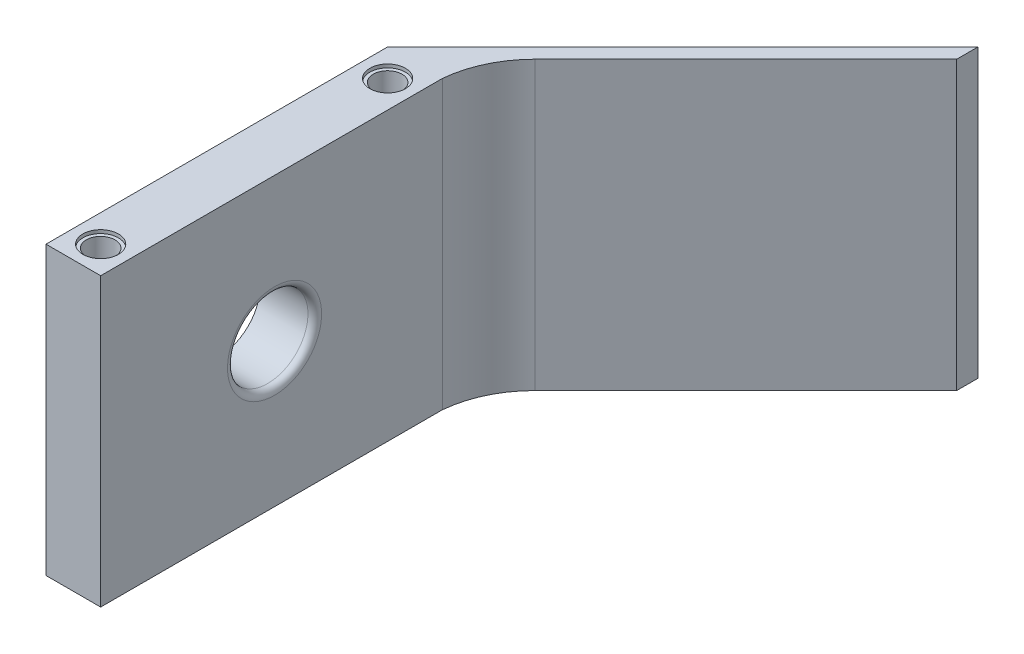
ISO-10303-21;
HEADER;
FILE_DESCRIPTION(('STEP AP214'),'2;1');
FILE_NAME('part.step','',(''),(''),'','','');
FILE_SCHEMA(('AUTOMOTIVE_DESIGN { 1 0 10303 214 1 1 1 1 }'));
ENDSEC;
DATA;
#1=APPLICATION_CONTEXT('core data for automotive mechanical design processes');
#2=APPLICATION_PROTOCOL_DEFINITION('international standard','automotive_design',2000,#1);
#3=PRODUCT_CONTEXT('',#1,'mechanical');
#4=PRODUCT('Part','Part','',(#3));
#5=PRODUCT_RELATED_PRODUCT_CATEGORY('part','',(#4));
#6=PRODUCT_DEFINITION_FORMATION('','',#4);
#7=PRODUCT_DEFINITION_CONTEXT('part definition',#1,'design');
#8=PRODUCT_DEFINITION('design','',#6,#7);
#9=PRODUCT_DEFINITION_SHAPE('','',#8);
#10=(LENGTH_UNIT() NAMED_UNIT(*) SI_UNIT(.MILLI.,.METRE.));
#11=(NAMED_UNIT(*) PLANE_ANGLE_UNIT() SI_UNIT($,.RADIAN.));
#12=(NAMED_UNIT(*) SI_UNIT($,.STERADIAN.) SOLID_ANGLE_UNIT());
#13=UNCERTAINTY_MEASURE_WITH_UNIT(LENGTH_MEASURE(1.E-05),#10,'distance_accuracy_value','');
#14=(GEOMETRIC_REPRESENTATION_CONTEXT(3) GLOBAL_UNCERTAINTY_ASSIGNED_CONTEXT((#13)) GLOBAL_UNIT_ASSIGNED_CONTEXT((#10,
#11,#12)) REPRESENTATION_CONTEXT('',''));
#15=CARTESIAN_POINT('',(0.,0.,0.));
#16=DIRECTION('',(0.,0.,1.));
#17=DIRECTION('',(1.,0.,0.));
#18=AXIS2_PLACEMENT_3D('',#15,#16,#17);
#19=CARTESIAN_POINT('',(-14.2230483271375,-42.,-32.3847583643123));
#20=DIRECTION('',(0.,1.,0.));
#21=DIRECTION('',(0.,0.,1.));
#22=AXIS2_PLACEMENT_3D('',#19,#20,#21);
#23=CYLINDRICAL_SURFACE('',#22,2.1);
#24=CARTESIAN_POINT('',(-14.2230483271375,-41.5,-32.3847583643123));
#25=DIRECTION('',(0.,-1.,0.));
#26=DIRECTION('',(0.,0.,-1.));
#27=AXIS2_PLACEMENT_3D('',#24,#25,#26);
#28=CIRCLE('',#27,2.1);
#29=CARTESIAN_POINT('',(-14.2230483271375,-41.5,-34.4847583643123));
#30=VERTEX_POINT('',#29);
#31=EDGE_CURVE('E155',#30,#30,#28,.T.);
#32=ORIENTED_EDGE('',*,*,#31,.T.);
#33=EDGE_LOOP('',(#32));
#34=FACE_BOUND('',#33,.T.);
#35=CARTESIAN_POINT('',(-14.2230483271375,-0.5,-32.3847583643123));
#36=DIRECTION('',(0.,1.,0.));
#37=DIRECTION('',(0.,0.,1.));
#38=AXIS2_PLACEMENT_3D('',#35,#36,#37);
#39=CIRCLE('',#38,2.1);
#40=CARTESIAN_POINT('',(-14.2230483271375,-0.5,-30.2847583643123));
#41=VERTEX_POINT('',#40);
#42=EDGE_CURVE('E138',#41,#41,#39,.F.);
#43=ORIENTED_EDGE('',*,*,#42,.F.);
#44=EDGE_LOOP('',(#43));
#45=FACE_BOUND('',#44,.T.);
#46=ADVANCED_FACE('F43',(#34,#45),#23,.F.);
#47=CARTESIAN_POINT('',(-14.2230483271375,-42.,9.61524163568774));
#48=DIRECTION('',(0.,1.,0.));
#49=DIRECTION('',(0.,0.,1.));
#50=AXIS2_PLACEMENT_3D('',#47,#48,#49);
#51=CYLINDRICAL_SURFACE('',#50,2.1);
#52=CARTESIAN_POINT('',(-14.2230483271375,-41.5,9.61524163568774));
#53=DIRECTION('',(0.,-1.,0.));
#54=DIRECTION('',(0.,0.,-1.));
#55=AXIS2_PLACEMENT_3D('',#52,#53,#54);
#56=CIRCLE('',#55,2.1);
#57=CARTESIAN_POINT('',(-14.2230483271375,-41.5,7.51524163568774));
#58=VERTEX_POINT('',#57);
#59=EDGE_CURVE('E151',#58,#58,#56,.F.);
#60=ORIENTED_EDGE('',*,*,#59,.F.);
#61=EDGE_LOOP('',(#60));
#62=FACE_BOUND('',#61,.T.);
#63=CARTESIAN_POINT('',(-14.2230483271375,-0.5,9.61524163568774));
#64=DIRECTION('',(0.,1.,0.));
#65=DIRECTION('',(0.,0.,1.));
#66=AXIS2_PLACEMENT_3D('',#63,#64,#65);
#67=CIRCLE('',#66,2.1);
#68=CARTESIAN_POINT('',(-14.2230483271375,-0.5,11.7152416356877));
#69=VERTEX_POINT('',#68);
#70=EDGE_CURVE('E146',#69,#69,#67,.T.);
#71=ORIENTED_EDGE('',*,*,#70,.T.);
#72=EDGE_LOOP('',(#71));
#73=FACE_BOUND('',#72,.T.);
#74=ADVANCED_FACE('F261',(#62,#73),#51,.F.);
#75=CARTESIAN_POINT('',(-10.2230483271375,3.,13.6152416356877));
#76=DIRECTION('',(0.,0.,-1.));
#77=DIRECTION('',(-1.,0.,0.));
#78=AXIS2_PLACEMENT_3D('',#75,#76,#77);
#79=PLANE('',#78);
#80=DIRECTION('',(0.,1.,0.));
#81=VECTOR('',#80,1.);
#82=CARTESIAN_POINT('',(-10.2230483271376,-42.,13.6152416356877));
#83=LINE('',#82,#81);
#84=CARTESIAN_POINT('',(-10.2230483271376,-42.,13.6152416356877));
#85=VERTEX_POINT('',#84);
#86=CARTESIAN_POINT('',(-10.2230483271376,0.,13.6152416356877));
#87=VERTEX_POINT('',#86);
#88=EDGE_CURVE('E197',#85,#87,#83,.T.);
#89=ORIENTED_EDGE('',*,*,#88,.T.);
#90=DIRECTION('',(1.,0.,0.));
#91=VECTOR('',#90,1.);
#92=CARTESIAN_POINT('',(14.7769516728625,0.,13.6152416356877));
#93=LINE('',#92,#91);
#94=CARTESIAN_POINT('',(-18.2230483271375,0.,13.6152416356877));
#95=VERTEX_POINT('',#94);
#96=EDGE_CURVE('E159',#95,#87,#93,.T.);
#97=ORIENTED_EDGE('',*,*,#96,.F.);
#98=DIRECTION('',(0.,1.,0.));
#99=VECTOR('',#98,1.);
#100=CARTESIAN_POINT('',(-18.2230483271375,3.,13.6152416356877));
#101=LINE('',#100,#99);
#102=CARTESIAN_POINT('',(-18.2230483271376,-42.,13.6152416356877));
#103=VERTEX_POINT('',#102);
#104=EDGE_CURVE('E212',#103,#95,#101,.T.);
#105=ORIENTED_EDGE('',*,*,#104,.F.);
#106=DIRECTION('',(-1.,0.,0.));
#107=VECTOR('',#106,1.);
#108=CARTESIAN_POINT('',(-18.2230483271376,-42.,13.6152416356877));
#109=LINE('',#108,#107);
#110=EDGE_CURVE('E193',#85,#103,#109,.T.);
#111=ORIENTED_EDGE('',*,*,#110,.F.);
#112=EDGE_LOOP('',(#89,#97,#105,#111));
#113=FACE_BOUND('',#112,.T.);
#114=ADVANCED_FACE('F248',(#113),#79,.F.);
#115=CARTESIAN_POINT('',(-18.2230483271375,0.,0.));
#116=DIRECTION('',(-1.,0.,0.));
#117=DIRECTION('',(0.,0.,1.));
#118=AXIS2_PLACEMENT_3D('',#115,#116,#117);
#119=PLANE('',#118);
#120=DIRECTION('',(0.,0.,1.));
#121=VECTOR('',#120,1.);
#122=CARTESIAN_POINT('',(-18.2230483271375,0.,0.));
#123=LINE('',#122,#121);
#124=CARTESIAN_POINT('',(-18.2230483271376,0.,-36.3847583643123));
#125=VERTEX_POINT('',#124);
#126=EDGE_CURVE('E162',#125,#95,#123,.T.);
#127=ORIENTED_EDGE('',*,*,#126,.F.);
#128=DIRECTION('',(0.,-1.,0.));
#129=VECTOR('',#128,1.);
#130=CARTESIAN_POINT('',(-18.2230483271376,3.,-36.3847583643123));
#131=LINE('',#130,#129);
#132=CARTESIAN_POINT('',(-18.2230483271376,-42.,-36.3847583643123));
#133=VERTEX_POINT('',#132);
#134=EDGE_CURVE('E208',#125,#133,#131,.T.);
#135=ORIENTED_EDGE('',*,*,#134,.T.);
#136=DIRECTION('',(0.,0.,-1.));
#137=VECTOR('',#136,1.);
#138=CARTESIAN_POINT('',(-18.2230483271376,-42.,-36.3847583643123));
#139=LINE('',#138,#137);
#140=EDGE_CURVE('E186',#103,#133,#139,.T.);
#141=ORIENTED_EDGE('',*,*,#140,.F.);
#142=ORIENTED_EDGE('',*,*,#104,.T.);
#143=EDGE_LOOP('',(#127,#135,#141,#142));
#144=FACE_BOUND('',#143,.T.);
#145=CARTESIAN_POINT('',(-18.2230483271375,-21.,-11.836279123996));
#146=DIRECTION('',(-1.,0.,0.));
#147=DIRECTION('',(0.,0.,1.));
#148=AXIS2_PLACEMENT_3D('',#145,#146,#147);
#149=CIRCLE('',#148,5.88897274573419);
#150=CARTESIAN_POINT('',(-18.2230483271375,-21.,-5.94730637826181));
#151=VERTEX_POINT('',#150);
#152=EDGE_CURVE('E165',#151,#151,#149,.T.);
#153=ORIENTED_EDGE('',*,*,#152,.F.);
#154=EDGE_LOOP('',(#153));
#155=FACE_BOUND('',#154,.T.);
#156=ADVANCED_FACE('F243',(#144,#155),#119,.T.);
#157=CARTESIAN_POINT('',(-10.2230483271376,-42.,-36.3847583643123));
#158=DIRECTION('',(-1.,0.,0.));
#159=DIRECTION('',(0.,0.,1.));
#160=AXIS2_PLACEMENT_3D('',#157,#158,#159);
#161=PLANE('',#160);
#162=CARTESIAN_POINT('',(-10.2230483271376,-21.,-11.836279123996));
#163=DIRECTION('',(-1.,0.,0.));
#164=DIRECTION('',(0.,0.,1.));
#165=AXIS2_PLACEMENT_3D('',#162,#163,#164);
#166=CIRCLE('',#165,6.88897274573419);
#167=CARTESIAN_POINT('',(-10.2230483271376,-21.,-4.94730637826182));
#168=VERTEX_POINT('',#167);
#169=EDGE_CURVE('E216',#168,#168,#166,.T.);
#170=ORIENTED_EDGE('',*,*,#169,.T.);
#171=EDGE_LOOP('',(#170));
#172=FACE_BOUND('',#171,.T.);
#173=DIRECTION('',(0.,0.,1.));
#174=VECTOR('',#173,1.);
#175=CARTESIAN_POINT('',(-10.2230483271376,0.,-36.3847583643123));
#176=LINE('',#175,#174);
#177=CARTESIAN_POINT('',(-10.2230483271376,0.,-36.3847583643123));
#178=VERTEX_POINT('',#177);
#179=EDGE_CURVE('E174',#178,#87,#176,.T.);
#180=ORIENTED_EDGE('',*,*,#179,.T.);
#181=ORIENTED_EDGE('',*,*,#88,.F.);
#182=DIRECTION('',(0.,0.,1.));
#183=VECTOR('',#182,1.);
#184=CARTESIAN_POINT('',(-10.2230483271376,-42.,-36.3847583643123));
#185=LINE('',#184,#183);
#186=CARTESIAN_POINT('',(-10.2230483271376,-42.,-36.3847583643123));
#187=VERTEX_POINT('',#186);
#188=EDGE_CURVE('E190',#187,#85,#185,.T.);
#189=ORIENTED_EDGE('',*,*,#188,.F.);
#190=DIRECTION('',(0.,1.,0.));
#191=VECTOR('',#190,1.);
#192=CARTESIAN_POINT('',(-10.2230483271376,-42.,-36.3847583643123));
#193=LINE('',#192,#191);
#194=EDGE_CURVE('E204',#187,#178,#193,.T.);
#195=ORIENTED_EDGE('',*,*,#194,.T.);
#196=EDGE_LOOP('',(#180,#181,#189,#195));
#197=FACE_BOUND('',#196,.T.);
#198=ADVANCED_FACE('F253',(#172,#197),#161,.F.);
#199=CARTESIAN_POINT('',(0.,-42.,0.));
#200=DIRECTION('',(0.,1.,0.));
#201=DIRECTION('',(0.,0.,1.));
#202=AXIS2_PLACEMENT_3D('',#199,#200,#201);
#203=PLANE('',#202);
#204=CARTESIAN_POINT('',(-14.2230483271375,-42.,-32.3847583643123));
#205=DIRECTION('',(0.,1.,0.));
#206=DIRECTION('',(0.,0.,1.));
#207=AXIS2_PLACEMENT_3D('',#204,#205,#206);
#208=CIRCLE('',#207,2.65);
#209=CARTESIAN_POINT('',(-14.2230483271375,-42.,-29.7347583643123));
#210=VERTEX_POINT('',#209);
#211=EDGE_CURVE('E175',#210,#210,#208,.T.);
#212=ORIENTED_EDGE('',*,*,#211,.T.);
#213=EDGE_LOOP('',(#212));
#214=FACE_BOUND('',#213,.T.);
#215=CARTESIAN_POINT('',(-14.2230483271375,-42.,9.61524163568773));
#216=DIRECTION('',(0.,1.,0.));
#217=DIRECTION('',(0.,0.,1.));
#218=AXIS2_PLACEMENT_3D('',#215,#216,#217);
#219=CIRCLE('',#218,2.65);
#220=CARTESIAN_POINT('',(-14.2230483271375,-42.,12.2652416356877));
#221=VERTEX_POINT('',#220);
#222=EDGE_CURVE('E169',#221,#221,#219,.T.);
#223=ORIENTED_EDGE('',*,*,#222,.T.);
#224=EDGE_LOOP('',(#223));
#225=FACE_BOUND('',#224,.T.);
#226=ORIENTED_EDGE('',*,*,#140,.T.);
#227=DIRECTION('',(0.707106781186546,0.,-0.707106781186549));
#228=VECTOR('',#227,1.);
#229=CARTESIAN_POINT('',(-18.2230483271376,-42.,-36.3847583643123));
#230=LINE('',#229,#228);
#231=CARTESIAN_POINT('',(24.9769516728623,-42.,-79.5847583643123));
#232=VERTEX_POINT('',#231);
#233=EDGE_CURVE('E133',#133,#232,#230,.T.);
#234=ORIENTED_EDGE('',*,*,#233,.T.);
#235=DIRECTION('',(0.,0.,1.));
#236=VECTOR('',#235,1.);
#237=CARTESIAN_POINT('',(24.9769516728623,-42.,-76.4722216294695));
#238=LINE('',#237,#236);
#239=CARTESIAN_POINT('',(24.9769516728623,-42.,-76.4722216294695));
#240=VERTEX_POINT('',#239);
#241=EDGE_CURVE('E128',#232,#240,#238,.T.);
#242=ORIENTED_EDGE('',*,*,#241,.T.);
#243=DIRECTION('',(-0.707106781186546,0.,0.707106781186549));
#244=VECTOR('',#243,1.);
#245=CARTESIAN_POINT('',(-15.1105115922948,-42.,-36.3847583643123));
#246=LINE('',#245,#244);
#247=CARTESIAN_POINT('',(-5.89422121343521,-42.,-45.6010487431719));
#248=VERTEX_POINT('',#247);
#249=EDGE_CURVE('E112',#240,#248,#246,.T.);
#250=ORIENTED_EDGE('',*,*,#249,.T.);
#251=CARTESIAN_POINT('',(4.71238050436302,-42.,-34.9944470253737));
#252=DIRECTION('',(0.,1.,0.));
#253=DIRECTION('',(0.,0.,1.));
#254=AXIS2_PLACEMENT_3D('',#251,#252,#253);
#255=CIRCLE('',#254,15.);
#256=EDGE_CURVE('E11',#248,#187,#255,.T.);
#257=ORIENTED_EDGE('',*,*,#256,.T.);
#258=ORIENTED_EDGE('',*,*,#188,.T.);
#259=ORIENTED_EDGE('',*,*,#110,.T.);
#260=EDGE_LOOP('',(#226,#234,#242,#250,#257,#258,#259));
#261=FACE_BOUND('',#260,.T.);
#262=ADVANCED_FACE('F236',(#214,#225,#261),#203,.F.);
#263=CARTESIAN_POINT('',(-14.2230483271375,-41.5,9.61524163568773));
#264=DIRECTION('',(0.,-1.,0.));
#265=DIRECTION('',(0.,0.,-1.));
#266=AXIS2_PLACEMENT_3D('',#263,#264,#265);
#267=CYLINDRICAL_SURFACE('',#266,2.65);
#268=CARTESIAN_POINT('',(-14.2230483271375,-41.5,9.61524163568773));
#269=DIRECTION('',(0.,1.,0.));
#270=DIRECTION('',(0.,0.,1.));
#271=AXIS2_PLACEMENT_3D('',#268,#269,#270);
#272=CIRCLE('',#271,2.65);
#273=CARTESIAN_POINT('',(-14.2230483271375,-41.5,12.2652416356877));
#274=VERTEX_POINT('',#273);
#275=EDGE_CURVE('E179',#274,#274,#272,.T.);
#276=ORIENTED_EDGE('',*,*,#275,.T.);
#277=EDGE_LOOP('',(#276));
#278=FACE_BOUND('',#277,.T.);
#279=ORIENTED_EDGE('',*,*,#222,.F.);
#280=EDGE_LOOP('',(#279));
#281=FACE_BOUND('',#280,.T.);
#282=ADVANCED_FACE('F292',(#278,#281),#267,.F.);
#283=CARTESIAN_POINT('',(-14.2230483271375,-41.5,9.61524163568773));
#284=DIRECTION('',(0.,-1.,0.));
#285=DIRECTION('',(0.,0.,1.));
#286=AXIS2_PLACEMENT_3D('',#283,#284,#285);
#287=PLANE('',#286);
#288=ORIENTED_EDGE('',*,*,#59,.T.);
#289=EDGE_LOOP('',(#288));
#290=FACE_BOUND('',#289,.T.);
#291=ORIENTED_EDGE('',*,*,#275,.F.);
#292=EDGE_LOOP('',(#291));
#293=FACE_BOUND('',#292,.T.);
#294=ADVANCED_FACE('F288',(#290,#293),#287,.T.);
#295=CARTESIAN_POINT('',(-14.2230483271375,-41.5,-32.3847583643123));
#296=DIRECTION('',(0.,-1.,0.));
#297=DIRECTION('',(0.,0.,-1.));
#298=AXIS2_PLACEMENT_3D('',#295,#296,#297);
#299=CYLINDRICAL_SURFACE('',#298,2.65);
#300=CARTESIAN_POINT('',(-14.2230483271375,-41.5,-32.3847583643123));
#301=DIRECTION('',(0.,1.,0.));
#302=DIRECTION('',(0.,0.,1.));
#303=AXIS2_PLACEMENT_3D('',#300,#301,#302);
#304=CIRCLE('',#303,2.65);
#305=CARTESIAN_POINT('',(-14.2230483271375,-41.5,-29.7347583643123));
#306=VERTEX_POINT('',#305);
#307=EDGE_CURVE('E170',#306,#306,#304,.T.);
#308=ORIENTED_EDGE('',*,*,#307,.T.);
#309=EDGE_LOOP('',(#308));
#310=FACE_BOUND('',#309,.T.);
#311=ORIENTED_EDGE('',*,*,#211,.F.);
#312=EDGE_LOOP('',(#311));
#313=FACE_BOUND('',#312,.T.);
#314=ADVANCED_FACE('F284',(#310,#313),#299,.F.);
#315=CARTESIAN_POINT('',(-14.2230483271375,-41.5,-32.3847583643123));
#316=DIRECTION('',(0.,-1.,0.));
#317=DIRECTION('',(0.,0.,1.));
#318=AXIS2_PLACEMENT_3D('',#315,#316,#317);
#319=PLANE('',#318);
#320=ORIENTED_EDGE('',*,*,#31,.F.);
#321=EDGE_LOOP('',(#320));
#322=FACE_BOUND('',#321,.T.);
#323=ORIENTED_EDGE('',*,*,#307,.F.);
#324=EDGE_LOOP('',(#323));
#325=FACE_BOUND('',#324,.T.);
#326=ADVANCED_FACE('F280',(#322,#325),#319,.T.);
#327=CARTESIAN_POINT('',(-9.22304832713755,-21.,-11.836279123996));
#328=DIRECTION('',(-1.,0.,0.));
#329=DIRECTION('',(0.,0.,1.));
#330=AXIS2_PLACEMENT_3D('',#327,#328,#329);
#331=CYLINDRICAL_SURFACE('',#330,5.88897274573419);
#332=CARTESIAN_POINT('',(-11.2230483271376,-21.,-11.836279123996));
#333=DIRECTION('',(-1.,0.,0.));
#334=DIRECTION('',(0.,0.,1.));
#335=AXIS2_PLACEMENT_3D('',#332,#333,#334);
#336=CIRCLE('',#335,5.88897274573419);
#337=CARTESIAN_POINT('',(-11.2230483271376,-21.,-5.94730637826182));
#338=VERTEX_POINT('',#337);
#339=EDGE_CURVE('E220',#338,#338,#336,.F.);
#340=ORIENTED_EDGE('',*,*,#339,.T.);
#341=EDGE_LOOP('',(#340));
#342=FACE_BOUND('',#341,.T.);
#343=ORIENTED_EDGE('',*,*,#152,.T.);
#344=EDGE_LOOP('',(#343));
#345=FACE_BOUND('',#344,.T.);
#346=ADVANCED_FACE('F277',(#342,#345),#331,.F.);
#347=CARTESIAN_POINT('',(-11.2230483271376,-21.,-11.836279123996));
#348=DIRECTION('',(-1.,0.,0.));
#349=DIRECTION('',(0.,0.,1.));
#350=AXIS2_PLACEMENT_3D('',#347,#348,#349);
#351=TOROIDAL_SURFACE('',#350,6.88897274573419,1.);
#352=ORIENTED_EDGE('',*,*,#339,.F.);
#353=EDGE_LOOP('',(#352));
#354=FACE_BOUND('',#353,.T.);
#355=ORIENTED_EDGE('',*,*,#169,.F.);
#356=EDGE_LOOP('',(#355));
#357=FACE_BOUND('',#356,.T.);
#358=ADVANCED_FACE('F275',(#354,#357),#351,.T.);
#359=CARTESIAN_POINT('',(14.7769516728625,0.,-36.3847583643123));
#360=DIRECTION('',(0.,-1.,0.));
#361=DIRECTION('',(0.,0.,-1.));
#362=AXIS2_PLACEMENT_3D('',#359,#360,#361);
#363=PLANE('',#362);
#364=CARTESIAN_POINT('',(-14.2230483271375,0.,-32.3847583643123));
#365=DIRECTION('',(0.,-1.,0.));
#366=DIRECTION('',(0.,0.,-1.));
#367=AXIS2_PLACEMENT_3D('',#364,#365,#366);
#368=CIRCLE('',#367,2.6);
#369=CARTESIAN_POINT('',(-14.2230483271375,0.,-34.9847583643123));
#370=VERTEX_POINT('',#369);
#371=EDGE_CURVE('E132',#370,#370,#368,.T.);
#372=ORIENTED_EDGE('',*,*,#371,.T.);
#373=EDGE_LOOP('',(#372));
#374=FACE_BOUND('',#373,.T.);
#375=CARTESIAN_POINT('',(-14.2230483271375,0.,9.61524163568774));
#376=DIRECTION('',(0.,1.,0.));
#377=DIRECTION('',(0.,0.,1.));
#378=AXIS2_PLACEMENT_3D('',#375,#376,#377);
#379=CIRCLE('',#378,2.6);
#380=CARTESIAN_POINT('',(-14.2230483271375,0.,12.2152416356877));
#381=VERTEX_POINT('',#380);
#382=EDGE_CURVE('E147',#381,#381,#379,.T.);
#383=ORIENTED_EDGE('',*,*,#382,.F.);
#384=EDGE_LOOP('',(#383));
#385=FACE_BOUND('',#384,.T.);
#386=ORIENTED_EDGE('',*,*,#126,.T.);
#387=ORIENTED_EDGE('',*,*,#96,.T.);
#388=ORIENTED_EDGE('',*,*,#179,.F.);
#389=CARTESIAN_POINT('',(4.71238050436302,0.,-34.9944470253737));
#390=DIRECTION('',(0.,-1.,0.));
#391=DIRECTION('',(0.,0.,-1.));
#392=AXIS2_PLACEMENT_3D('',#389,#390,#391);
#393=CIRCLE('',#392,15.);
#394=CARTESIAN_POINT('',(-5.8942212134352,0.,-45.6010487431719));
#395=VERTEX_POINT('',#394);
#396=EDGE_CURVE('E52',#178,#395,#393,.T.);
#397=ORIENTED_EDGE('',*,*,#396,.T.);
#398=DIRECTION('',(0.707106781186546,0.,-0.707106781186549));
#399=VECTOR('',#398,1.);
#400=CARTESIAN_POINT('',(-15.1105115922948,0.,-36.3847583643123));
#401=LINE('',#400,#399);
#402=CARTESIAN_POINT('',(24.9769516728623,0.,-76.4722216294695));
#403=VERTEX_POINT('',#402);
#404=EDGE_CURVE('E100',#395,#403,#401,.T.);
#405=ORIENTED_EDGE('',*,*,#404,.T.);
#406=DIRECTION('',(0.,0.,-1.));
#407=VECTOR('',#406,1.);
#408=CARTESIAN_POINT('',(24.9769516728623,0.,-76.4722216294695));
#409=LINE('',#408,#407);
#410=CARTESIAN_POINT('',(24.9769516728623,0.,-79.5847583643123));
#411=VERTEX_POINT('',#410);
#412=EDGE_CURVE('E105',#403,#411,#409,.T.);
#413=ORIENTED_EDGE('',*,*,#412,.T.);
#414=DIRECTION('',(-0.707106781186546,0.,0.707106781186549));
#415=VECTOR('',#414,1.);
#416=CARTESIAN_POINT('',(-18.2230483271376,0.,-36.3847583643123));
#417=LINE('',#416,#415);
#418=EDGE_CURVE('E117',#411,#125,#417,.T.);
#419=ORIENTED_EDGE('',*,*,#418,.T.);
#420=EDGE_LOOP('',(#386,#387,#388,#397,#405,#413,#419));
#421=FACE_BOUND('',#420,.T.);
#422=ADVANCED_FACE('F102',(#374,#385,#421),#363,.F.);
#423=CARTESIAN_POINT('',(-14.2230483271375,-0.5,9.61524163568774));
#424=DIRECTION('',(0.,1.,0.));
#425=DIRECTION('',(0.,0.,1.));
#426=AXIS2_PLACEMENT_3D('',#423,#424,#425);
#427=CYLINDRICAL_SURFACE('',#426,2.6);
#428=CARTESIAN_POINT('',(-14.2230483271375,-0.5,9.61524163568774));
#429=DIRECTION('',(0.,1.,0.));
#430=DIRECTION('',(0.,0.,1.));
#431=AXIS2_PLACEMENT_3D('',#428,#429,#430);
#432=CIRCLE('',#431,2.6);
#433=CARTESIAN_POINT('',(-14.2230483271375,-0.5,12.2152416356877));
#434=VERTEX_POINT('',#433);
#435=EDGE_CURVE('E142',#434,#434,#432,.T.);
#436=ORIENTED_EDGE('',*,*,#435,.F.);
#437=EDGE_LOOP('',(#436));
#438=FACE_BOUND('',#437,.T.);
#439=ORIENTED_EDGE('',*,*,#382,.T.);
#440=EDGE_LOOP('',(#439));
#441=FACE_BOUND('',#440,.T.);
#442=ADVANCED_FACE('F274',(#438,#441),#427,.F.);
#443=CARTESIAN_POINT('',(-14.2230483271375,-0.5,9.61524163568774));
#444=DIRECTION('',(0.,1.,0.));
#445=DIRECTION('',(0.,0.,1.));
#446=AXIS2_PLACEMENT_3D('',#443,#444,#445);
#447=PLANE('',#446);
#448=ORIENTED_EDGE('',*,*,#70,.F.);
#449=EDGE_LOOP('',(#448));
#450=FACE_BOUND('',#449,.T.);
#451=ORIENTED_EDGE('',*,*,#435,.T.);
#452=EDGE_LOOP('',(#451));
#453=FACE_BOUND('',#452,.T.);
#454=ADVANCED_FACE('F330',(#450,#453),#447,.T.);
#455=CARTESIAN_POINT('',(-14.2230483271375,-0.5,-32.3847583643123));
#456=DIRECTION('',(0.,1.,0.));
#457=DIRECTION('',(0.,0.,-1.));
#458=AXIS2_PLACEMENT_3D('',#455,#456,#457);
#459=PLANE('',#458);
#460=CARTESIAN_POINT('',(-14.2230483271375,-0.5,-32.3847583643123));
#461=DIRECTION('',(0.,-1.,0.));
#462=DIRECTION('',(0.,0.,-1.));
#463=AXIS2_PLACEMENT_3D('',#460,#461,#462);
#464=CIRCLE('',#463,2.6);
#465=CARTESIAN_POINT('',(-14.2230483271375,-0.5,-34.9847583643123));
#466=VERTEX_POINT('',#465);
#467=EDGE_CURVE('E134',#466,#466,#464,.T.);
#468=ORIENTED_EDGE('',*,*,#467,.F.);
#469=EDGE_LOOP('',(#468));
#470=FACE_BOUND('',#469,.T.);
#471=ORIENTED_EDGE('',*,*,#42,.T.);
#472=EDGE_LOOP('',(#471));
#473=FACE_BOUND('',#472,.T.);
#474=ADVANCED_FACE('F338',(#470,#473),#459,.T.);
#475=CARTESIAN_POINT('',(-14.2230483271375,-0.5,-32.3847583643123));
#476=DIRECTION('',(0.,1.,0.));
#477=DIRECTION('',(0.,0.,1.));
#478=AXIS2_PLACEMENT_3D('',#475,#476,#477);
#479=CYLINDRICAL_SURFACE('',#478,2.6);
#480=ORIENTED_EDGE('',*,*,#467,.T.);
#481=EDGE_LOOP('',(#480));
#482=FACE_BOUND('',#481,.T.);
#483=ORIENTED_EDGE('',*,*,#371,.F.);
#484=EDGE_LOOP('',(#483));
#485=FACE_BOUND('',#484,.T.);
#486=ADVANCED_FACE('F346',(#482,#485),#479,.F.);
#487=CARTESIAN_POINT('',(-18.2230483271376,-103.094025894518,-36.3847583643123));
#488=DIRECTION('',(-0.707106781186549,0.,-0.707106781186546));
#489=DIRECTION('',(-0.707106781186546,0.,0.707106781186549));
#490=AXIS2_PLACEMENT_3D('',#487,#488,#489);
#491=PLANE('',#490);
#492=ORIENTED_EDGE('',*,*,#233,.F.);
#493=ORIENTED_EDGE('',*,*,#134,.F.);
#494=ORIENTED_EDGE('',*,*,#418,.F.);
#495=DIRECTION('',(0.,1.,0.));
#496=VECTOR('',#495,1.);
#497=CARTESIAN_POINT('',(24.9769516728623,-103.094025894518,-79.5847583643123));
#498=LINE('',#497,#496);
#499=EDGE_CURVE('E116',#232,#411,#498,.T.);
#500=ORIENTED_EDGE('',*,*,#499,.F.);
#501=EDGE_LOOP('',(#492,#493,#494,#500));
#502=FACE_BOUND('',#501,.T.);
#503=ADVANCED_FACE('F239',(#502),#491,.T.);
#504=CARTESIAN_POINT('',(24.9769516728623,-103.094025894518,-76.4722216294695));
#505=DIRECTION('',(1.,0.,0.));
#506=DIRECTION('',(0.,0.,-1.));
#507=AXIS2_PLACEMENT_3D('',#504,#505,#506);
#508=PLANE('',#507);
#509=ORIENTED_EDGE('',*,*,#241,.F.);
#510=ORIENTED_EDGE('',*,*,#499,.T.);
#511=ORIENTED_EDGE('',*,*,#412,.F.);
#512=DIRECTION('',(0.,1.,0.));
#513=VECTOR('',#512,1.);
#514=CARTESIAN_POINT('',(24.9769516728623,-103.094025894518,-76.4722216294695));
#515=LINE('',#514,#513);
#516=EDGE_CURVE('E110',#240,#403,#515,.T.);
#517=ORIENTED_EDGE('',*,*,#516,.F.);
#518=EDGE_LOOP('',(#509,#510,#511,#517));
#519=FACE_BOUND('',#518,.T.);
#520=ADVANCED_FACE('F119',(#519),#508,.T.);
#521=CARTESIAN_POINT('',(-15.1105115922948,-103.094025894518,-36.3847583643123));
#522=DIRECTION('',(0.707106781186549,0.,0.707106781186546));
#523=DIRECTION('',(0.707106781186546,0.,-0.707106781186549));
#524=AXIS2_PLACEMENT_3D('',#521,#522,#523);
#525=PLANE('',#524);
#526=ORIENTED_EDGE('',*,*,#404,.F.);
#527=DIRECTION('',(0.,1.,0.));
#528=VECTOR('',#527,1.);
#529=CARTESIAN_POINT('',(-5.89422121343521,-42.,-45.6010487431719));
#530=LINE('',#529,#528);
#531=EDGE_CURVE('E65',#395,#248,#530,.F.);
#532=ORIENTED_EDGE('',*,*,#531,.T.);
#533=ORIENTED_EDGE('',*,*,#249,.F.);
#534=ORIENTED_EDGE('',*,*,#516,.T.);
#535=EDGE_LOOP('',(#526,#532,#533,#534));
#536=FACE_BOUND('',#535,.T.);
#537=ADVANCED_FACE('F111',(#536),#525,.T.);
#538=CARTESIAN_POINT('',(4.71238050436302,3.,-34.9944470253737));
#539=DIRECTION('',(0.,-1.,0.));
#540=DIRECTION('',(0.,0.,-1.));
#541=AXIS2_PLACEMENT_3D('',#538,#539,#540);
#542=CYLINDRICAL_SURFACE('',#541,15.);
#543=ORIENTED_EDGE('',*,*,#256,.F.);
#544=ORIENTED_EDGE('',*,*,#531,.F.);
#545=ORIENTED_EDGE('',*,*,#396,.F.);
#546=ORIENTED_EDGE('',*,*,#194,.F.);
#547=EDGE_LOOP('',(#543,#544,#545,#546));
#548=FACE_BOUND('',#547,.T.);
#549=ADVANCED_FACE('F45',(#548),#542,.F.);
#550=CLOSED_SHELL('',(#46,#74,#114,#156,#198,#262,#282,#294,#314,#326,#346,#358,#422,#442,#454,
#474,#486,#503,#520,#537,#549));
#551=MANIFOLD_SOLID_BREP('B2',#550);
#552=ADVANCED_BREP_SHAPE_REPRESENTATION('',(#18,#551),#14);
#553=SHAPE_DEFINITION_REPRESENTATION(#9,#552);
ENDSEC;
END-ISO-10303-21;
